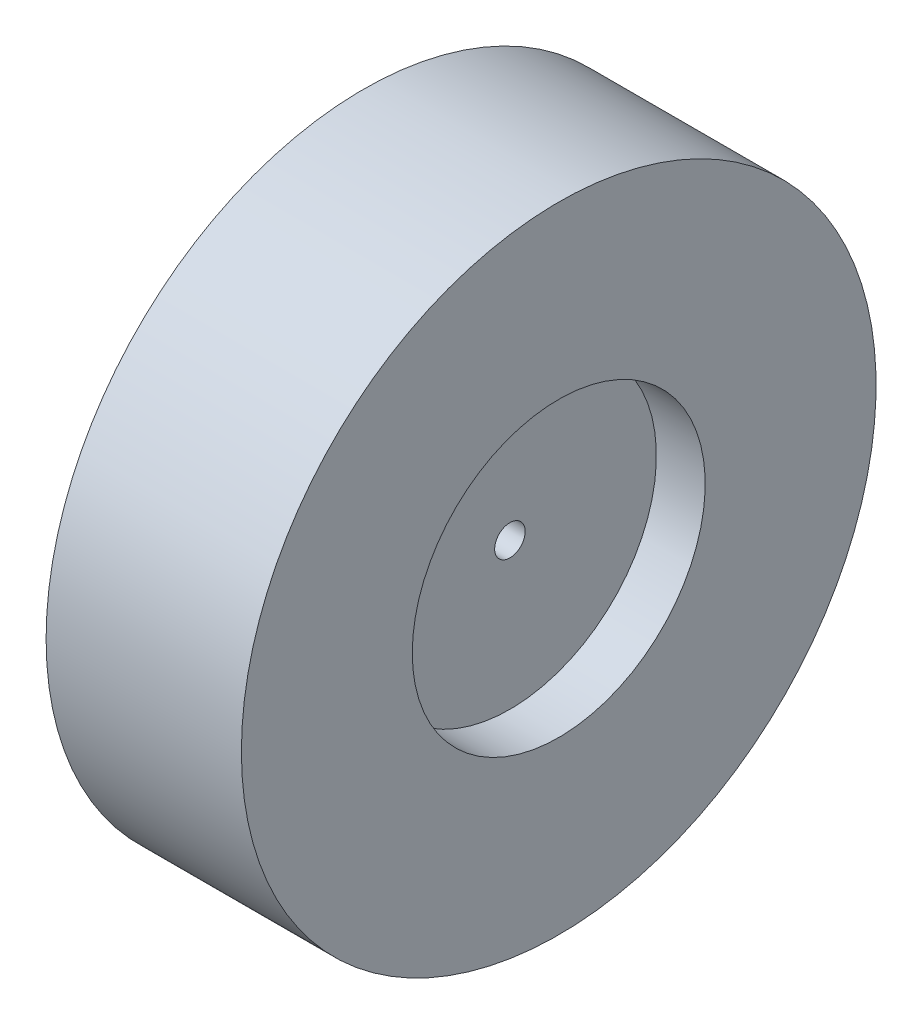
ISO-10303-21;
HEADER;
FILE_DESCRIPTION(('STEP AP214'),'2;1');
FILE_NAME('part.step','',(''),(''),'','','');
FILE_SCHEMA(('AUTOMOTIVE_DESIGN { 1 0 10303 214 1 1 1 1 }'));
ENDSEC;
DATA;
#1=APPLICATION_CONTEXT('core data for automotive mechanical design processes');
#2=APPLICATION_PROTOCOL_DEFINITION('international standard','automotive_design',2000,#1);
#3=PRODUCT_CONTEXT('',#1,'mechanical');
#4=PRODUCT('Part','Part','',(#3));
#5=PRODUCT_RELATED_PRODUCT_CATEGORY('part','',(#4));
#6=PRODUCT_DEFINITION_FORMATION('','',#4);
#7=PRODUCT_DEFINITION_CONTEXT('part definition',#1,'design');
#8=PRODUCT_DEFINITION('design','',#6,#7);
#9=PRODUCT_DEFINITION_SHAPE('','',#8);
#10=(LENGTH_UNIT() NAMED_UNIT(*) SI_UNIT(.MILLI.,.METRE.));
#11=(NAMED_UNIT(*) PLANE_ANGLE_UNIT() SI_UNIT($,.RADIAN.));
#12=(NAMED_UNIT(*) SI_UNIT($,.STERADIAN.) SOLID_ANGLE_UNIT());
#13=UNCERTAINTY_MEASURE_WITH_UNIT(LENGTH_MEASURE(1.E-05),#10,'distance_accuracy_value','');
#14=(GEOMETRIC_REPRESENTATION_CONTEXT(3) GLOBAL_UNCERTAINTY_ASSIGNED_CONTEXT((#13)) GLOBAL_UNIT_ASSIGNED_CONTEXT((#10,
#11,#12)) REPRESENTATION_CONTEXT('',''));
#15=CARTESIAN_POINT('',(0.,0.,0.));
#16=DIRECTION('',(0.,0.,1.));
#17=DIRECTION('',(1.,0.,0.));
#18=AXIS2_PLACEMENT_3D('',#15,#16,#17);
#19=CARTESIAN_POINT('',(50.8,0.,-76.2));
#20=DIRECTION('',(-1.,0.,0.));
#21=DIRECTION('',(0.,0.,1.));
#22=AXIS2_PLACEMENT_3D('',#19,#20,#21);
#23=PLANE('',#22);
#24=CARTESIAN_POINT('',(50.8,0.,0.));
#25=DIRECTION('',(-1.,0.,0.));
#26=DIRECTION('',(0.,0.,1.));
#27=AXIS2_PLACEMENT_3D('',#24,#25,#26);
#28=CIRCLE('',#27,165.1);
#29=CARTESIAN_POINT('',(50.8,0.,165.1));
#30=VERTEX_POINT('',#29);
#31=EDGE_CURVE('E78',#30,#30,#28,.T.);
#32=ORIENTED_EDGE('',*,*,#31,.F.);
#33=EDGE_LOOP('',(#32));
#34=FACE_BOUND('',#33,.T.);
#35=CARTESIAN_POINT('',(50.8,0.,0.));
#36=DIRECTION('',(-1.,0.,0.));
#37=DIRECTION('',(0.,0.,1.));
#38=AXIS2_PLACEMENT_3D('',#35,#36,#37);
#39=CIRCLE('',#38,76.2);
#40=CARTESIAN_POINT('',(50.8,0.,76.2));
#41=VERTEX_POINT('',#40);
#42=EDGE_CURVE('E10',#41,#41,#39,.T.);
#43=ORIENTED_EDGE('',*,*,#42,.T.);
#44=EDGE_LOOP('',(#43));
#45=FACE_BOUND('',#44,.T.);
#46=ADVANCED_FACE('F43',(#34,#45),#23,.F.);
#47=CARTESIAN_POINT('',(-25.4,0.,0.));
#48=DIRECTION('',(-1.,0.,0.));
#49=DIRECTION('',(0.,0.,1.));
#50=AXIS2_PLACEMENT_3D('',#47,#48,#49);
#51=CYLINDRICAL_SURFACE('',#50,76.2);
#52=ORIENTED_EDGE('',*,*,#42,.F.);
#53=EDGE_LOOP('',(#52));
#54=FACE_BOUND('',#53,.T.);
#55=CARTESIAN_POINT('',(25.4,0.,0.));
#56=DIRECTION('',(-1.,0.,0.));
#57=DIRECTION('',(0.,0.,1.));
#58=AXIS2_PLACEMENT_3D('',#55,#56,#57);
#59=CIRCLE('',#58,76.2);
#60=CARTESIAN_POINT('',(25.4,0.,76.2));
#61=VERTEX_POINT('',#60);
#62=EDGE_CURVE('E50',#61,#61,#59,.T.);
#63=ORIENTED_EDGE('',*,*,#62,.T.);
#64=EDGE_LOOP('',(#63));
#65=FACE_BOUND('',#64,.T.);
#66=ADVANCED_FACE('F86',(#54,#65),#51,.F.);
#67=CARTESIAN_POINT('',(25.4,0.,-7.93750000000001));
#68=DIRECTION('',(-1.,0.,0.));
#69=DIRECTION('',(0.,0.,1.));
#70=AXIS2_PLACEMENT_3D('',#67,#68,#69);
#71=PLANE('',#70);
#72=ORIENTED_EDGE('',*,*,#62,.F.);
#73=EDGE_LOOP('',(#72));
#74=FACE_BOUND('',#73,.T.);
#75=CARTESIAN_POINT('',(25.4,0.,0.));
#76=DIRECTION('',(-1.,0.,0.));
#77=DIRECTION('',(0.,0.,1.));
#78=AXIS2_PLACEMENT_3D('',#75,#76,#77);
#79=CIRCLE('',#78,7.9375);
#80=CARTESIAN_POINT('',(25.4,0.,7.93749999999999));
#81=VERTEX_POINT('',#80);
#82=EDGE_CURVE('E55',#81,#81,#79,.T.);
#83=ORIENTED_EDGE('',*,*,#82,.T.);
#84=EDGE_LOOP('',(#83));
#85=FACE_BOUND('',#84,.T.);
#86=ADVANCED_FACE('F90',(#74,#85),#71,.F.);
#87=CARTESIAN_POINT('',(-25.4,0.,0.));
#88=DIRECTION('',(-1.,0.,0.));
#89=DIRECTION('',(0.,0.,1.));
#90=AXIS2_PLACEMENT_3D('',#87,#88,#89);
#91=CYLINDRICAL_SURFACE('',#90,7.9375);
#92=ORIENTED_EDGE('',*,*,#82,.F.);
#93=EDGE_LOOP('',(#92));
#94=FACE_BOUND('',#93,.T.);
#95=CARTESIAN_POINT('',(-25.4,0.,0.));
#96=DIRECTION('',(-1.,0.,0.));
#97=DIRECTION('',(0.,0.,1.));
#98=AXIS2_PLACEMENT_3D('',#95,#96,#97);
#99=CIRCLE('',#98,7.9375);
#100=CARTESIAN_POINT('',(-25.4,0.,7.9375));
#101=VERTEX_POINT('',#100);
#102=EDGE_CURVE('E60',#101,#101,#99,.T.);
#103=ORIENTED_EDGE('',*,*,#102,.T.);
#104=EDGE_LOOP('',(#103));
#105=FACE_BOUND('',#104,.T.);
#106=ADVANCED_FACE('F95',(#94,#105),#91,.F.);
#107=CARTESIAN_POINT('',(-25.4,0.,-7.9375));
#108=DIRECTION('',(1.,0.,0.));
#109=DIRECTION('',(0.,0.,-1.));
#110=AXIS2_PLACEMENT_3D('',#107,#108,#109);
#111=PLANE('',#110);
#112=ORIENTED_EDGE('',*,*,#102,.F.);
#113=EDGE_LOOP('',(#112));
#114=FACE_BOUND('',#113,.T.);
#115=CARTESIAN_POINT('',(-25.4,0.,0.));
#116=DIRECTION('',(-1.,0.,0.));
#117=DIRECTION('',(0.,0.,1.));
#118=AXIS2_PLACEMENT_3D('',#115,#116,#117);
#119=CIRCLE('',#118,76.2);
#120=CARTESIAN_POINT('',(-25.4,0.,76.2));
#121=VERTEX_POINT('',#120);
#122=EDGE_CURVE('E66',#121,#121,#119,.T.);
#123=ORIENTED_EDGE('',*,*,#122,.T.);
#124=EDGE_LOOP('',(#123));
#125=FACE_BOUND('',#124,.T.);
#126=ADVANCED_FACE('F101',(#114,#125),#111,.F.);
#127=CARTESIAN_POINT('',(-25.4,0.,0.));
#128=DIRECTION('',(-1.,0.,0.));
#129=DIRECTION('',(0.,0.,1.));
#130=AXIS2_PLACEMENT_3D('',#127,#128,#129);
#131=CYLINDRICAL_SURFACE('',#130,76.2);
#132=ORIENTED_EDGE('',*,*,#122,.F.);
#133=EDGE_LOOP('',(#132));
#134=FACE_BOUND('',#133,.T.);
#135=CARTESIAN_POINT('',(-50.8,0.,0.));
#136=DIRECTION('',(-1.,0.,0.));
#137=DIRECTION('',(0.,0.,1.));
#138=AXIS2_PLACEMENT_3D('',#135,#136,#137);
#139=CIRCLE('',#138,76.2);
#140=CARTESIAN_POINT('',(-50.8,0.,76.2));
#141=VERTEX_POINT('',#140);
#142=EDGE_CURVE('E70',#141,#141,#139,.T.);
#143=ORIENTED_EDGE('',*,*,#142,.T.);
#144=EDGE_LOOP('',(#143));
#145=FACE_BOUND('',#144,.T.);
#146=ADVANCED_FACE('F105',(#134,#145),#131,.F.);
#147=CARTESIAN_POINT('',(-50.8,0.,-76.2));
#148=DIRECTION('',(1.,0.,0.));
#149=DIRECTION('',(0.,0.,-1.));
#150=AXIS2_PLACEMENT_3D('',#147,#148,#149);
#151=PLANE('',#150);
#152=ORIENTED_EDGE('',*,*,#142,.F.);
#153=EDGE_LOOP('',(#152));
#154=FACE_BOUND('',#153,.T.);
#155=CARTESIAN_POINT('',(-50.8,0.,0.));
#156=DIRECTION('',(-1.,0.,0.));
#157=DIRECTION('',(0.,0.,1.));
#158=AXIS2_PLACEMENT_3D('',#155,#156,#157);
#159=CIRCLE('',#158,165.1);
#160=CARTESIAN_POINT('',(-50.7999999999999,0.,165.1));
#161=VERTEX_POINT('',#160);
#162=EDGE_CURVE('E74',#161,#161,#159,.T.);
#163=ORIENTED_EDGE('',*,*,#162,.T.);
#164=EDGE_LOOP('',(#163));
#165=FACE_BOUND('',#164,.T.);
#166=ADVANCED_FACE('F109',(#154,#165),#151,.F.);
#167=CARTESIAN_POINT('',(-25.4,0.,0.));
#168=DIRECTION('',(-1.,0.,0.));
#169=DIRECTION('',(0.,0.,1.));
#170=AXIS2_PLACEMENT_3D('',#167,#168,#169);
#171=CYLINDRICAL_SURFACE('',#170,165.1);
#172=ORIENTED_EDGE('',*,*,#162,.F.);
#173=EDGE_LOOP('',(#172));
#174=FACE_BOUND('',#173,.T.);
#175=ORIENTED_EDGE('',*,*,#31,.T.);
#176=EDGE_LOOP('',(#175));
#177=FACE_BOUND('',#176,.T.);
#178=ADVANCED_FACE('F83',(#174,#177),#171,.T.);
#179=CLOSED_SHELL('',(#46,#66,#86,#106,#126,#146,#166,#178));
#180=MANIFOLD_SOLID_BREP('B2',#179);
#181=ADVANCED_BREP_SHAPE_REPRESENTATION('',(#18,#180),#14);
#182=SHAPE_DEFINITION_REPRESENTATION(#9,#181);
ENDSEC;
END-ISO-10303-21;
